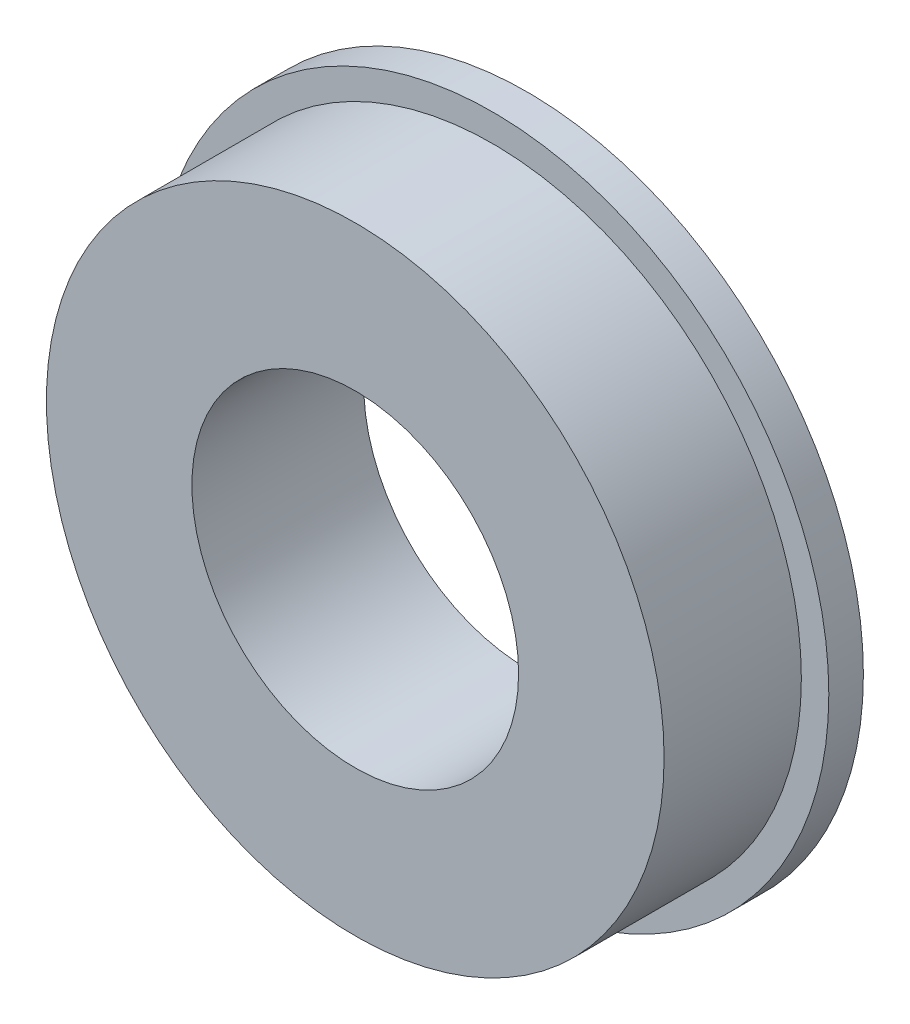
ISO-10303-21;
HEADER;
FILE_DESCRIPTION(('STEP AP214'),'2;1');
FILE_NAME('part.step','',(''),(''),'','','');
FILE_SCHEMA(('AUTOMOTIVE_DESIGN { 1 0 10303 214 1 1 1 1 }'));
ENDSEC;
DATA;
#1=APPLICATION_CONTEXT('core data for automotive mechanical design processes');
#2=APPLICATION_PROTOCOL_DEFINITION('international standard','automotive_design',2000,#1);
#3=PRODUCT_CONTEXT('',#1,'mechanical');
#4=PRODUCT('Part','Part','',(#3));
#5=PRODUCT_RELATED_PRODUCT_CATEGORY('part','',(#4));
#6=PRODUCT_DEFINITION_FORMATION('','',#4);
#7=PRODUCT_DEFINITION_CONTEXT('part definition',#1,'design');
#8=PRODUCT_DEFINITION('design','',#6,#7);
#9=PRODUCT_DEFINITION_SHAPE('','',#8);
#10=(LENGTH_UNIT() NAMED_UNIT(*) SI_UNIT(.MILLI.,.METRE.));
#11=(NAMED_UNIT(*) PLANE_ANGLE_UNIT() SI_UNIT($,.RADIAN.));
#12=(NAMED_UNIT(*) SI_UNIT($,.STERADIAN.) SOLID_ANGLE_UNIT());
#13=UNCERTAINTY_MEASURE_WITH_UNIT(LENGTH_MEASURE(1.E-05),#10,'distance_accuracy_value','');
#14=(GEOMETRIC_REPRESENTATION_CONTEXT(3) GLOBAL_UNCERTAINTY_ASSIGNED_CONTEXT((#13)) GLOBAL_UNIT_ASSIGNED_CONTEXT((#10,
#11,#12)) REPRESENTATION_CONTEXT('',''));
#15=CARTESIAN_POINT('',(0.,0.,0.));
#16=DIRECTION('',(0.,0.,1.));
#17=DIRECTION('',(1.,0.,0.));
#18=AXIS2_PLACEMENT_3D('',#15,#16,#17);
#19=CARTESIAN_POINT('',(0.,0.,1.6002));
#20=DIRECTION('',(0.,0.,-1.));
#21=DIRECTION('',(-1.,0.,0.));
#22=AXIS2_PLACEMENT_3D('',#19,#20,#21);
#23=CYLINDRICAL_SURFACE('',#22,15.5575);
#24=CARTESIAN_POINT('',(0.,0.,1.6002));
#25=DIRECTION('',(0.,0.,1.));
#26=DIRECTION('',(1.,0.,0.));
#27=AXIS2_PLACEMENT_3D('',#24,#25,#26);
#28=CIRCLE('',#27,15.5575);
#29=CARTESIAN_POINT('',(15.5575,0.,1.6002));
#30=VERTEX_POINT('',#29);
#31=EDGE_CURVE('E51',#30,#30,#28,.T.);
#32=ORIENTED_EDGE('',*,*,#31,.F.);
#33=EDGE_LOOP('',(#32));
#34=FACE_BOUND('',#33,.T.);
#35=CARTESIAN_POINT('',(0.,0.,0.));
#36=DIRECTION('',(0.,0.,1.));
#37=DIRECTION('',(1.,0.,0.));
#38=AXIS2_PLACEMENT_3D('',#35,#36,#37);
#39=CIRCLE('',#38,15.5575);
#40=CARTESIAN_POINT('',(15.5575,0.,0.));
#41=VERTEX_POINT('',#40);
#42=EDGE_CURVE('E46',#41,#41,#39,.T.);
#43=ORIENTED_EDGE('',*,*,#42,.T.);
#44=EDGE_LOOP('',(#43));
#45=FACE_BOUND('',#44,.T.);
#46=ADVANCED_FACE('F43',(#34,#45),#23,.T.);
#47=CARTESIAN_POINT('',(0.,0.,1.6002));
#48=DIRECTION('',(0.,0.,1.));
#49=DIRECTION('',(1.,0.,0.));
#50=AXIS2_PLACEMENT_3D('',#47,#48,#49);
#51=PLANE('',#50);
#52=CARTESIAN_POINT('',(0.,0.,1.6002));
#53=DIRECTION('',(0.,0.,1.));
#54=DIRECTION('',(1.,0.,0.));
#55=AXIS2_PLACEMENT_3D('',#52,#53,#54);
#56=CIRCLE('',#55,14.2875);
#57=CARTESIAN_POINT('',(14.2875,0.,1.6002));
#58=VERTEX_POINT('',#57);
#59=EDGE_CURVE('E10',#58,#58,#56,.T.);
#60=ORIENTED_EDGE('',*,*,#59,.F.);
#61=EDGE_LOOP('',(#60));
#62=FACE_BOUND('',#61,.T.);
#63=ORIENTED_EDGE('',*,*,#31,.T.);
#64=EDGE_LOOP('',(#63));
#65=FACE_BOUND('',#64,.T.);
#66=ADVANCED_FACE('F93',(#62,#65),#51,.T.);
#67=CARTESIAN_POINT('',(0.,0.,0.));
#68=DIRECTION('',(0.,0.,1.));
#69=DIRECTION('',(1.,0.,0.));
#70=AXIS2_PLACEMENT_3D('',#67,#68,#69);
#71=PLANE('',#70);
#72=CARTESIAN_POINT('',(0.,0.,0.));
#73=DIRECTION('',(0.,0.,1.));
#74=DIRECTION('',(1.,0.,0.));
#75=AXIS2_PLACEMENT_3D('',#72,#73,#74);
#76=CIRCLE('',#75,7.5565);
#77=CARTESIAN_POINT('',(7.5565,0.,0.));
#78=VERTEX_POINT('',#77);
#79=EDGE_CURVE('E62',#78,#78,#76,.T.);
#80=ORIENTED_EDGE('',*,*,#79,.T.);
#81=EDGE_LOOP('',(#80));
#82=FACE_BOUND('',#81,.T.);
#83=ORIENTED_EDGE('',*,*,#42,.F.);
#84=EDGE_LOOP('',(#83));
#85=FACE_BOUND('',#84,.T.);
#86=ADVANCED_FACE('F71',(#82,#85),#71,.F.);
#87=CARTESIAN_POINT('',(0.,0.,7.9502));
#88=DIRECTION('',(0.,0.,-1.));
#89=DIRECTION('',(-1.,0.,0.));
#90=AXIS2_PLACEMENT_3D('',#87,#88,#89);
#91=CYLINDRICAL_SURFACE('',#90,14.2875);
#92=CARTESIAN_POINT('',(0.,0.,7.9502));
#93=DIRECTION('',(0.,0.,1.));
#94=DIRECTION('',(1.,0.,0.));
#95=AXIS2_PLACEMENT_3D('',#92,#93,#94);
#96=CIRCLE('',#95,14.2875);
#97=CARTESIAN_POINT('',(14.2875,0.,7.9502));
#98=VERTEX_POINT('',#97);
#99=EDGE_CURVE('E58',#98,#98,#96,.T.);
#100=ORIENTED_EDGE('',*,*,#99,.F.);
#101=EDGE_LOOP('',(#100));
#102=FACE_BOUND('',#101,.T.);
#103=ORIENTED_EDGE('',*,*,#59,.T.);
#104=EDGE_LOOP('',(#103));
#105=FACE_BOUND('',#104,.T.);
#106=ADVANCED_FACE('F83',(#102,#105),#91,.T.);
#107=CARTESIAN_POINT('',(0.,0.,7.9502));
#108=DIRECTION('',(0.,0.,1.));
#109=DIRECTION('',(1.,0.,0.));
#110=AXIS2_PLACEMENT_3D('',#107,#108,#109);
#111=PLANE('',#110);
#112=CARTESIAN_POINT('',(0.,0.,7.9502));
#113=DIRECTION('',(0.,0.,1.));
#114=DIRECTION('',(1.,0.,0.));
#115=AXIS2_PLACEMENT_3D('',#112,#113,#114);
#116=CIRCLE('',#115,7.5565);
#117=CARTESIAN_POINT('',(7.5565,0.,7.9502));
#118=VERTEX_POINT('',#117);
#119=EDGE_CURVE('E63',#118,#118,#116,.T.);
#120=ORIENTED_EDGE('',*,*,#119,.F.);
#121=EDGE_LOOP('',(#120));
#122=FACE_BOUND('',#121,.T.);
#123=ORIENTED_EDGE('',*,*,#99,.T.);
#124=EDGE_LOOP('',(#123));
#125=FACE_BOUND('',#124,.T.);
#126=ADVANCED_FACE('F77',(#122,#125),#111,.T.);
#127=CARTESIAN_POINT('',(0.,0.,0.));
#128=DIRECTION('',(0.,0.,1.));
#129=DIRECTION('',(1.,0.,0.));
#130=AXIS2_PLACEMENT_3D('',#127,#128,#129);
#131=CYLINDRICAL_SURFACE('',#130,7.5565);
#132=ORIENTED_EDGE('',*,*,#79,.F.);
#133=EDGE_LOOP('',(#132));
#134=FACE_BOUND('',#133,.T.);
#135=ORIENTED_EDGE('',*,*,#119,.T.);
#136=EDGE_LOOP('',(#135));
#137=FACE_BOUND('',#136,.T.);
#138=ADVANCED_FACE('F74',(#134,#137),#131,.F.);
#139=CLOSED_SHELL('',(#46,#66,#86,#106,#126,#138));
#140=MANIFOLD_SOLID_BREP('B2',#139);
#141=ADVANCED_BREP_SHAPE_REPRESENTATION('',(#18,#140),#14);
#142=SHAPE_DEFINITION_REPRESENTATION(#9,#141);
ENDSEC;
END-ISO-10303-21;
